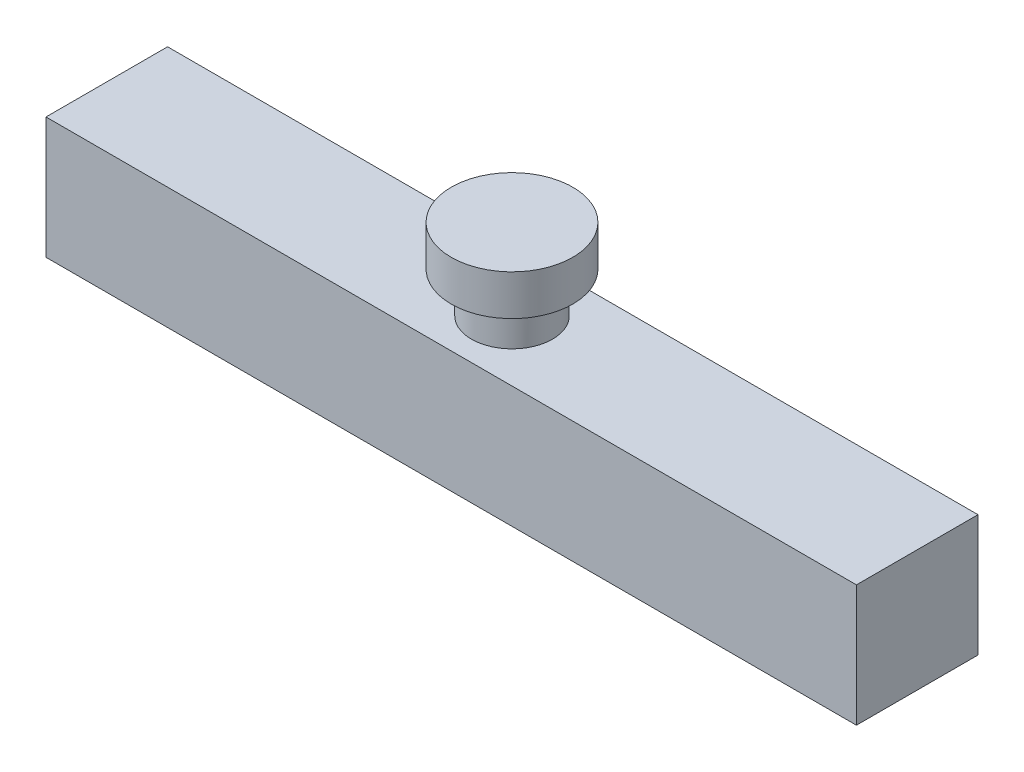
ISO-10303-21;
HEADER;
FILE_DESCRIPTION(('STEP AP214'),'2;1');
FILE_NAME('part.step','',(''),(''),'','','');
FILE_SCHEMA(('AUTOMOTIVE_DESIGN { 1 0 10303 214 1 1 1 1 }'));
ENDSEC;
DATA;
#1=APPLICATION_CONTEXT('core data for automotive mechanical design processes');
#2=APPLICATION_PROTOCOL_DEFINITION('international standard','automotive_design',2000,#1);
#3=PRODUCT_CONTEXT('',#1,'mechanical');
#4=PRODUCT('Part','Part','',(#3));
#5=PRODUCT_RELATED_PRODUCT_CATEGORY('part','',(#4));
#6=PRODUCT_DEFINITION_FORMATION('','',#4);
#7=PRODUCT_DEFINITION_CONTEXT('part definition',#1,'design');
#8=PRODUCT_DEFINITION('design','',#6,#7);
#9=PRODUCT_DEFINITION_SHAPE('','',#8);
#10=(LENGTH_UNIT() NAMED_UNIT(*) SI_UNIT(.MILLI.,.METRE.));
#11=(NAMED_UNIT(*) PLANE_ANGLE_UNIT() SI_UNIT($,.RADIAN.));
#12=(NAMED_UNIT(*) SI_UNIT($,.STERADIAN.) SOLID_ANGLE_UNIT());
#13=UNCERTAINTY_MEASURE_WITH_UNIT(LENGTH_MEASURE(1.E-05),#10,'distance_accuracy_value','');
#14=(GEOMETRIC_REPRESENTATION_CONTEXT(3) GLOBAL_UNCERTAINTY_ASSIGNED_CONTEXT((#13)) GLOBAL_UNIT_ASSIGNED_CONTEXT((#10,
#11,#12)) REPRESENTATION_CONTEXT('',''));
#15=CARTESIAN_POINT('',(0.,0.,0.));
#16=DIRECTION('',(0.,0.,1.));
#17=DIRECTION('',(1.,0.,0.));
#18=AXIS2_PLACEMENT_3D('',#15,#16,#17);
#19=CARTESIAN_POINT('',(0.,-30.,0.));
#20=DIRECTION('',(-1.,0.,0.));
#21=DIRECTION('',(0.,0.,1.));
#22=AXIS2_PLACEMENT_3D('',#19,#20,#21);
#23=PLANE('',#22);
#24=DIRECTION('',(0.,1.,0.));
#25=VECTOR('',#24,1.);
#26=CARTESIAN_POINT('',(0.,-50.,15.));
#27=LINE('',#26,#25);
#28=CARTESIAN_POINT('',(0.,-30.,15.));
#29=VERTEX_POINT('',#28);
#30=CARTESIAN_POINT('',(0.,0.,15.));
#31=VERTEX_POINT('',#30);
#32=EDGE_CURVE('E64',#29,#31,#27,.T.);
#33=ORIENTED_EDGE('',*,*,#32,.F.);
#34=DIRECTION('',(0.,0.,1.));
#35=VECTOR('',#34,1.);
#36=CARTESIAN_POINT('',(0.,-30.,0.));
#37=LINE('',#36,#35);
#38=CARTESIAN_POINT('',(0.,-30.,45.));
#39=VERTEX_POINT('',#38);
#40=EDGE_CURVE('E103',#29,#39,#37,.T.);
#41=ORIENTED_EDGE('',*,*,#40,.T.);
#42=DIRECTION('',(0.,1.,0.));
#43=VECTOR('',#42,1.);
#44=CARTESIAN_POINT('',(0.,-50.,45.));
#45=LINE('',#44,#43);
#46=CARTESIAN_POINT('',(0.,0.,45.));
#47=VERTEX_POINT('',#46);
#48=EDGE_CURVE('E89',#39,#47,#45,.T.);
#49=ORIENTED_EDGE('',*,*,#48,.T.);
#50=DIRECTION('',(0.,0.,1.));
#51=VECTOR('',#50,1.);
#52=CARTESIAN_POINT('',(0.,0.,0.));
#53=LINE('',#52,#51);
#54=EDGE_CURVE('E104',#31,#47,#53,.T.);
#55=ORIENTED_EDGE('',*,*,#54,.F.);
#56=EDGE_LOOP('',(#33,#41,#49,#55));
#57=FACE_BOUND('',#56,.T.);
#58=ADVANCED_FACE('F41',(#57),#23,.T.);
#59=CARTESIAN_POINT('',(200.,-30.,0.));
#60=DIRECTION('',(1.,0.,0.));
#61=DIRECTION('',(0.,0.,-1.));
#62=AXIS2_PLACEMENT_3D('',#59,#60,#61);
#63=PLANE('',#62);
#64=DIRECTION('',(0.,1.,0.));
#65=VECTOR('',#64,1.);
#66=CARTESIAN_POINT('',(200.,-50.,15.));
#67=LINE('',#66,#65);
#68=CARTESIAN_POINT('',(200.,-30.,15.));
#69=VERTEX_POINT('',#68);
#70=CARTESIAN_POINT('',(200.,0.,15.));
#71=VERTEX_POINT('',#70);
#72=EDGE_CURVE('E82',#69,#71,#67,.T.);
#73=ORIENTED_EDGE('',*,*,#72,.T.);
#74=DIRECTION('',(0.,0.,-1.));
#75=VECTOR('',#74,1.);
#76=CARTESIAN_POINT('',(200.,0.,0.));
#77=LINE('',#76,#75);
#78=CARTESIAN_POINT('',(200.,0.,45.));
#79=VERTEX_POINT('',#78);
#80=EDGE_CURVE('E95',#79,#71,#77,.T.);
#81=ORIENTED_EDGE('',*,*,#80,.F.);
#82=DIRECTION('',(0.,1.,0.));
#83=VECTOR('',#82,1.);
#84=CARTESIAN_POINT('',(200.,-50.,45.));
#85=LINE('',#84,#83);
#86=CARTESIAN_POINT('',(200.,-30.,45.));
#87=VERTEX_POINT('',#86);
#88=EDGE_CURVE('E56',#87,#79,#85,.T.);
#89=ORIENTED_EDGE('',*,*,#88,.F.);
#90=DIRECTION('',(0.,0.,-1.));
#91=VECTOR('',#90,1.);
#92=CARTESIAN_POINT('',(200.,-30.,0.));
#93=LINE('',#92,#91);
#94=EDGE_CURVE('E49',#87,#69,#93,.T.);
#95=ORIENTED_EDGE('',*,*,#94,.T.);
#96=EDGE_LOOP('',(#73,#81,#89,#95));
#97=FACE_BOUND('',#96,.T.);
#98=ADVANCED_FACE('F94',(#97),#63,.T.);
#99=CARTESIAN_POINT('',(0.,-30.,0.));
#100=DIRECTION('',(0.,-1.,0.));
#101=DIRECTION('',(0.,0.,-1.));
#102=AXIS2_PLACEMENT_3D('',#99,#100,#101);
#103=PLANE('',#102);
#104=DIRECTION('',(-1.,0.,0.));
#105=VECTOR('',#104,1.);
#106=CARTESIAN_POINT('',(0.,-30.,15.));
#107=LINE('',#106,#105);
#108=EDGE_CURVE('E122',#69,#29,#107,.T.);
#109=ORIENTED_EDGE('',*,*,#108,.F.);
#110=ORIENTED_EDGE('',*,*,#94,.F.);
#111=DIRECTION('',(1.,0.,0.));
#112=VECTOR('',#111,1.);
#113=CARTESIAN_POINT('',(0.,-30.,45.));
#114=LINE('',#113,#112);
#115=EDGE_CURVE('E98',#39,#87,#114,.T.);
#116=ORIENTED_EDGE('',*,*,#115,.F.);
#117=ORIENTED_EDGE('',*,*,#40,.F.);
#118=EDGE_LOOP('',(#109,#110,#116,#117));
#119=FACE_BOUND('',#118,.T.);
#120=ADVANCED_FACE('F143',(#119),#103,.T.);
#121=CARTESIAN_POINT('',(0.,0.,0.));
#122=DIRECTION('',(0.,-1.,0.));
#123=DIRECTION('',(0.,0.,-1.));
#124=AXIS2_PLACEMENT_3D('',#121,#122,#123);
#125=PLANE('',#124);
#126=CARTESIAN_POINT('',(100.,0.,30.));
#127=DIRECTION('',(0.,-1.,0.));
#128=DIRECTION('',(0.,0.,-1.));
#129=AXIS2_PLACEMENT_3D('',#126,#127,#128);
#130=CIRCLE('',#129,9.99999999999999);
#131=CARTESIAN_POINT('',(100.,0.,20.));
#132=VERTEX_POINT('',#131);
#133=EDGE_CURVE('E11',#132,#132,#130,.F.);
#134=ORIENTED_EDGE('',*,*,#133,.F.);
#135=EDGE_LOOP('',(#134));
#136=FACE_BOUND('',#135,.T.);
#137=ORIENTED_EDGE('',*,*,#80,.T.);
#138=DIRECTION('',(1.,0.,0.));
#139=VECTOR('',#138,1.);
#140=CARTESIAN_POINT('',(0.,0.,15.));
#141=LINE('',#140,#139);
#142=EDGE_CURVE('E79',#31,#71,#141,.T.);
#143=ORIENTED_EDGE('',*,*,#142,.F.);
#144=ORIENTED_EDGE('',*,*,#54,.T.);
#145=DIRECTION('',(-1.,0.,0.));
#146=VECTOR('',#145,1.);
#147=CARTESIAN_POINT('',(0.,0.,45.));
#148=LINE('',#147,#146);
#149=EDGE_CURVE('E101',#79,#47,#148,.T.);
#150=ORIENTED_EDGE('',*,*,#149,.F.);
#151=EDGE_LOOP('',(#137,#143,#144,#150));
#152=FACE_BOUND('',#151,.T.);
#153=ADVANCED_FACE('F100',(#136,#152),#125,.F.);
#154=CARTESIAN_POINT('',(100.,10.,30.));
#155=DIRECTION('',(0.,-1.,0.));
#156=DIRECTION('',(0.,0.,-1.));
#157=AXIS2_PLACEMENT_3D('',#154,#155,#156);
#158=CYLINDRICAL_SURFACE('',#157,9.99999999999999);
#159=CARTESIAN_POINT('',(100.,10.,30.));
#160=DIRECTION('',(0.,1.,0.));
#161=DIRECTION('',(0.,0.,1.));
#162=AXIS2_PLACEMENT_3D('',#159,#160,#161);
#163=CIRCLE('',#162,9.99999999999999);
#164=CARTESIAN_POINT('',(100.,10.,40.));
#165=VERTEX_POINT('',#164);
#166=EDGE_CURVE('E109',#165,#165,#163,.T.);
#167=ORIENTED_EDGE('',*,*,#166,.F.);
#168=EDGE_LOOP('',(#167));
#169=FACE_BOUND('',#168,.T.);
#170=ORIENTED_EDGE('',*,*,#133,.T.);
#171=EDGE_LOOP('',(#170));
#172=FACE_BOUND('',#171,.T.);
#173=ADVANCED_FACE('F150',(#169,#172),#158,.T.);
#174=CARTESIAN_POINT('',(100.,20.,30.));
#175=DIRECTION('',(0.,-1.,0.));
#176=DIRECTION('',(0.,0.,-1.));
#177=AXIS2_PLACEMENT_3D('',#174,#175,#176);
#178=CYLINDRICAL_SURFACE('',#177,15.);
#179=CARTESIAN_POINT('',(100.,20.,30.));
#180=DIRECTION('',(0.,1.,0.));
#181=DIRECTION('',(0.,0.,1.));
#182=AXIS2_PLACEMENT_3D('',#179,#180,#181);
#183=CIRCLE('',#182,15.);
#184=CARTESIAN_POINT('',(100.,20.,45.));
#185=VERTEX_POINT('',#184);
#186=EDGE_CURVE('E117',#185,#185,#183,.T.);
#187=ORIENTED_EDGE('',*,*,#186,.F.);
#188=EDGE_LOOP('',(#187));
#189=FACE_BOUND('',#188,.T.);
#190=CARTESIAN_POINT('',(100.,10.,30.));
#191=DIRECTION('',(0.,1.,0.));
#192=DIRECTION('',(0.,0.,1.));
#193=AXIS2_PLACEMENT_3D('',#190,#191,#192);
#194=CIRCLE('',#193,15.);
#195=CARTESIAN_POINT('',(100.,10.,45.));
#196=VERTEX_POINT('',#195);
#197=EDGE_CURVE('E118',#196,#196,#194,.T.);
#198=ORIENTED_EDGE('',*,*,#197,.T.);
#199=EDGE_LOOP('',(#198));
#200=FACE_BOUND('',#199,.T.);
#201=ADVANCED_FACE('F201',(#189,#200),#178,.T.);
#202=CARTESIAN_POINT('',(100.,20.,30.));
#203=DIRECTION('',(0.,1.,0.));
#204=DIRECTION('',(0.,0.,1.));
#205=AXIS2_PLACEMENT_3D('',#202,#203,#204);
#206=PLANE('',#205);
#207=ORIENTED_EDGE('',*,*,#186,.T.);
#208=EDGE_LOOP('',(#207));
#209=FACE_BOUND('',#208,.T.);
#210=ADVANCED_FACE('F198',(#209),#206,.T.);
#211=CARTESIAN_POINT('',(100.,10.,30.));
#212=DIRECTION('',(0.,1.,0.));
#213=DIRECTION('',(0.,0.,1.));
#214=AXIS2_PLACEMENT_3D('',#211,#212,#213);
#215=PLANE('',#214);
#216=ORIENTED_EDGE('',*,*,#166,.T.);
#217=EDGE_LOOP('',(#216));
#218=FACE_BOUND('',#217,.T.);
#219=ORIENTED_EDGE('',*,*,#197,.F.);
#220=EDGE_LOOP('',(#219));
#221=FACE_BOUND('',#220,.T.);
#222=ADVANCED_FACE('F183',(#218,#221),#215,.F.);
#223=CARTESIAN_POINT('',(0.,-50.,45.));
#224=DIRECTION('',(0.,0.,-1.));
#225=DIRECTION('',(-1.,0.,0.));
#226=AXIS2_PLACEMENT_3D('',#223,#224,#225);
#227=PLANE('',#226);
#228=ORIENTED_EDGE('',*,*,#115,.T.);
#229=ORIENTED_EDGE('',*,*,#88,.T.);
#230=ORIENTED_EDGE('',*,*,#149,.T.);
#231=ORIENTED_EDGE('',*,*,#48,.F.);
#232=EDGE_LOOP('',(#228,#229,#230,#231));
#233=FACE_BOUND('',#232,.T.);
#234=ADVANCED_FACE('F138',(#233),#227,.F.);
#235=CARTESIAN_POINT('',(0.,-50.,15.));
#236=DIRECTION('',(0.,0.,1.));
#237=DIRECTION('',(1.,0.,0.));
#238=AXIS2_PLACEMENT_3D('',#235,#236,#237);
#239=PLANE('',#238);
#240=ORIENTED_EDGE('',*,*,#108,.T.);
#241=ORIENTED_EDGE('',*,*,#32,.T.);
#242=ORIENTED_EDGE('',*,*,#142,.T.);
#243=ORIENTED_EDGE('',*,*,#72,.F.);
#244=EDGE_LOOP('',(#240,#241,#242,#243));
#245=FACE_BOUND('',#244,.T.);
#246=ADVANCED_FACE('F81',(#245),#239,.F.);
#247=CLOSED_SHELL('',(#58,#98,#120,#153,#173,#201,#210,#222,#234,#246));
#248=MANIFOLD_SOLID_BREP('B2',#247);
#249=ADVANCED_BREP_SHAPE_REPRESENTATION('',(#18,#248),#14);
#250=SHAPE_DEFINITION_REPRESENTATION(#9,#249);
ENDSEC;
END-ISO-10303-21;
